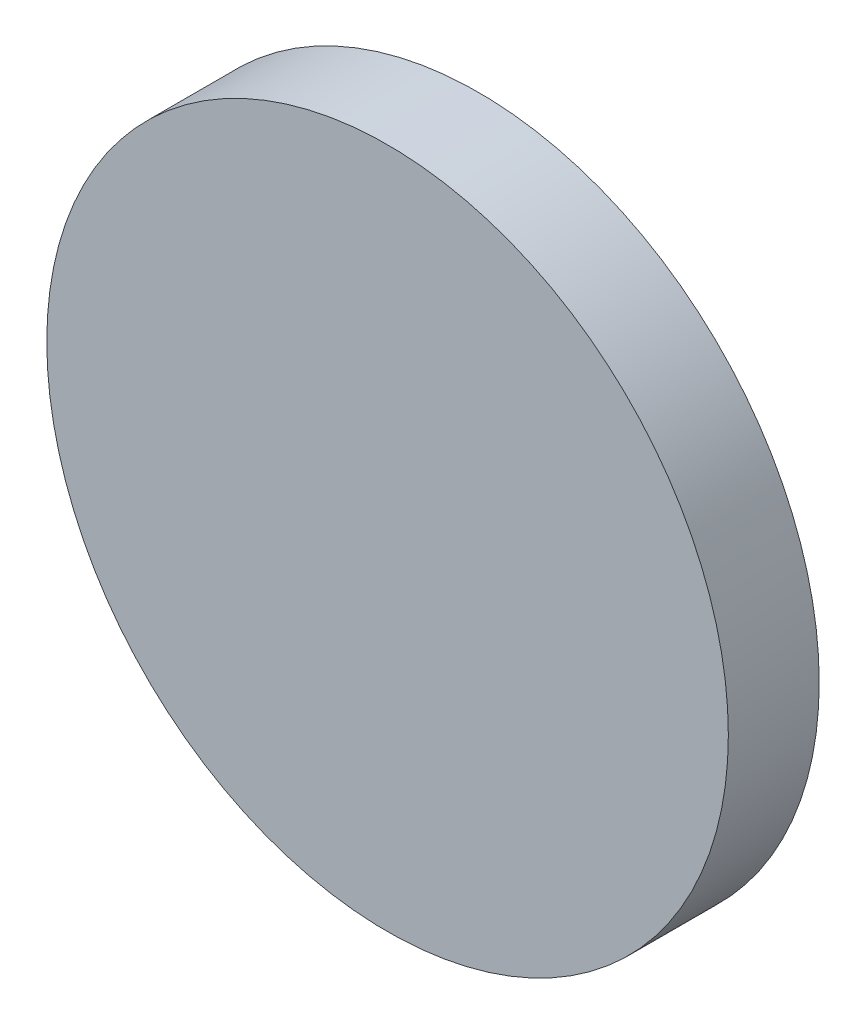
ISO-10303-21;
HEADER;
FILE_DESCRIPTION(('STEP AP214'),'2;1');
FILE_NAME('part.step','',(''),(''),'','','');
FILE_SCHEMA(('AUTOMOTIVE_DESIGN { 1 0 10303 214 1 1 1 1 }'));
ENDSEC;
DATA;
#1=APPLICATION_CONTEXT('core data for automotive mechanical design processes');
#2=APPLICATION_PROTOCOL_DEFINITION('international standard','automotive_design',2000,#1);
#3=PRODUCT_CONTEXT('',#1,'mechanical');
#4=PRODUCT('Part','Part','',(#3));
#5=PRODUCT_RELATED_PRODUCT_CATEGORY('part','',(#4));
#6=PRODUCT_DEFINITION_FORMATION('','',#4);
#7=PRODUCT_DEFINITION_CONTEXT('part definition',#1,'design');
#8=PRODUCT_DEFINITION('design','',#6,#7);
#9=PRODUCT_DEFINITION_SHAPE('','',#8);
#10=(LENGTH_UNIT() NAMED_UNIT(*) SI_UNIT(.MILLI.,.METRE.));
#11=(NAMED_UNIT(*) PLANE_ANGLE_UNIT() SI_UNIT($,.RADIAN.));
#12=(NAMED_UNIT(*) SI_UNIT($,.STERADIAN.) SOLID_ANGLE_UNIT());
#13=UNCERTAINTY_MEASURE_WITH_UNIT(LENGTH_MEASURE(1.E-05),#10,'distance_accuracy_value','');
#14=(GEOMETRIC_REPRESENTATION_CONTEXT(3) GLOBAL_UNCERTAINTY_ASSIGNED_CONTEXT((#13)) GLOBAL_UNIT_ASSIGNED_CONTEXT((#10,
#11,#12)) REPRESENTATION_CONTEXT('',''));
#15=CARTESIAN_POINT('',(0.,0.,0.));
#16=DIRECTION('',(0.,0.,1.));
#17=DIRECTION('',(1.,0.,0.));
#18=AXIS2_PLACEMENT_3D('',#15,#16,#17);
#19=CARTESIAN_POINT('',(145.,-188.494606384248,674.330286890471));
#20=DIRECTION('',(0.,0.,-1.));
#21=DIRECTION('',(-1.,0.,0.));
#22=AXIS2_PLACEMENT_3D('',#19,#20,#21);
#23=CYLINDRICAL_SURFACE('',#22,225.);
#24=CARTESIAN_POINT('',(145.,-188.494606384248,674.330286890471));
#25=DIRECTION('',(0.,0.,1.));
#26=DIRECTION('',(1.,0.,0.));
#27=AXIS2_PLACEMENT_3D('',#24,#25,#26);
#28=CIRCLE('',#27,225.);
#29=CARTESIAN_POINT('',(-80.,-188.494606384248,674.330286890471));
#30=VERTEX_POINT('',#29);
#31=EDGE_CURVE('E10',#30,#30,#28,.T.);
#32=CARTESIAN_POINT('',(145.,-188.494606384248,614.330286890471));
#33=DIRECTION('',(0.,0.,1.));
#34=DIRECTION('',(1.,0.,0.));
#35=AXIS2_PLACEMENT_3D('',#32,#33,#34);
#36=CIRCLE('',#35,225.);
#37=CARTESIAN_POINT('',(-80.,-188.494606384248,614.330286890471));
#38=VERTEX_POINT('',#37);
#39=EDGE_CURVE('E40',#38,#38,#36,.T.);
#40=CARTESIAN_POINT('',(-80.,-188.494606384248,674.330286890471));
#41=CARTESIAN_POINT('',(-80.,-188.494606384248,673.705286890471));
#42=CARTESIAN_POINT('',(-80.,-188.494606384248,673.080286890471));
#43=CARTESIAN_POINT('',(-80.,-188.494606384248,671.830286890471));
#44=CARTESIAN_POINT('',(-80.,-188.494606384248,671.205286890471));
#45=CARTESIAN_POINT('',(-80.,-188.494606384248,669.955286890471));
#46=CARTESIAN_POINT('',(-80.,-188.494606384248,669.330286890471));
#47=CARTESIAN_POINT('',(-80.,-188.494606384248,668.080286890471));
#48=CARTESIAN_POINT('',(-80.,-188.494606384248,667.455286890471));
#49=CARTESIAN_POINT('',(-80.,-188.494606384248,666.205286890471));
#50=CARTESIAN_POINT('',(-80.,-188.494606384248,665.580286890471));
#51=CARTESIAN_POINT('',(-80.,-188.494606384248,664.330286890471));
#52=CARTESIAN_POINT('',(-80.,-188.494606384248,663.705286890471));
#53=CARTESIAN_POINT('',(-80.,-188.494606384248,662.455286890471));
#54=CARTESIAN_POINT('',(-80.,-188.494606384248,661.830286890471));
#55=CARTESIAN_POINT('',(-80.,-188.494606384248,660.580286890471));
#56=CARTESIAN_POINT('',(-80.,-188.494606384248,659.955286890471));
#57=CARTESIAN_POINT('',(-80.,-188.494606384248,658.705286890471));
#58=CARTESIAN_POINT('',(-80.,-188.494606384248,658.080286890471));
#59=CARTESIAN_POINT('',(-80.,-188.494606384248,656.830286890471));
#60=CARTESIAN_POINT('',(-80.,-188.494606384248,656.205286890471));
#61=CARTESIAN_POINT('',(-80.,-188.494606384248,654.955286890471));
#62=CARTESIAN_POINT('',(-80.,-188.494606384248,654.330286890471));
#63=CARTESIAN_POINT('',(-80.,-188.494606384248,653.080286890471));
#64=CARTESIAN_POINT('',(-80.,-188.494606384248,652.455286890471));
#65=CARTESIAN_POINT('',(-80.,-188.494606384248,651.205286890471));
#66=CARTESIAN_POINT('',(-80.,-188.494606384248,650.580286890471));
#67=CARTESIAN_POINT('',(-80.,-188.494606384248,649.330286890471));
#68=CARTESIAN_POINT('',(-80.,-188.494606384248,648.705286890471));
#69=CARTESIAN_POINT('',(-80.,-188.494606384248,647.455286890471));
#70=CARTESIAN_POINT('',(-80.,-188.494606384248,646.830286890471));
#71=CARTESIAN_POINT('',(-80.,-188.494606384248,645.580286890471));
#72=CARTESIAN_POINT('',(-80.,-188.494606384248,644.955286890471));
#73=CARTESIAN_POINT('',(-80.,-188.494606384248,643.705286890471));
#74=CARTESIAN_POINT('',(-80.,-188.494606384248,643.080286890471));
#75=CARTESIAN_POINT('',(-80.,-188.494606384248,641.830286890471));
#76=CARTESIAN_POINT('',(-80.,-188.494606384248,641.205286890471));
#77=CARTESIAN_POINT('',(-80.,-188.494606384248,639.955286890471));
#78=CARTESIAN_POINT('',(-80.,-188.494606384248,639.330286890471));
#79=CARTESIAN_POINT('',(-80.,-188.494606384248,638.080286890471));
#80=CARTESIAN_POINT('',(-80.,-188.494606384248,637.455286890471));
#81=CARTESIAN_POINT('',(-80.,-188.494606384248,636.205286890471));
#82=CARTESIAN_POINT('',(-80.,-188.494606384248,635.580286890471));
#83=CARTESIAN_POINT('',(-80.,-188.494606384248,634.330286890471));
#84=CARTESIAN_POINT('',(-80.,-188.494606384248,633.705286890471));
#85=CARTESIAN_POINT('',(-80.,-188.494606384248,632.455286890471));
#86=CARTESIAN_POINT('',(-80.,-188.494606384248,631.830286890471));
#87=CARTESIAN_POINT('',(-80.,-188.494606384248,630.580286890471));
#88=CARTESIAN_POINT('',(-80.,-188.494606384248,629.955286890471));
#89=CARTESIAN_POINT('',(-80.,-188.494606384248,628.705286890471));
#90=CARTESIAN_POINT('',(-80.,-188.494606384248,628.080286890471));
#91=CARTESIAN_POINT('',(-80.,-188.494606384248,626.830286890471));
#92=CARTESIAN_POINT('',(-80.,-188.494606384248,626.205286890471));
#93=CARTESIAN_POINT('',(-80.,-188.494606384248,624.955286890471));
#94=CARTESIAN_POINT('',(-80.,-188.494606384248,624.330286890471));
#95=CARTESIAN_POINT('',(-80.,-188.494606384248,623.080286890471));
#96=CARTESIAN_POINT('',(-80.,-188.494606384248,622.455286890471));
#97=CARTESIAN_POINT('',(-80.,-188.494606384248,621.205286890471));
#98=CARTESIAN_POINT('',(-80.,-188.494606384248,620.580286890471));
#99=CARTESIAN_POINT('',(-80.,-188.494606384248,619.330286890471));
#100=CARTESIAN_POINT('',(-80.,-188.494606384248,618.705286890471));
#101=CARTESIAN_POINT('',(-80.,-188.494606384248,617.455286890471));
#102=CARTESIAN_POINT('',(-80.,-188.494606384248,616.830286890471));
#103=CARTESIAN_POINT('',(-80.,-188.494606384248,615.580286890471));
#104=CARTESIAN_POINT('',(-80.,-188.494606384248,614.955286890471));
#105=CARTESIAN_POINT('',(-80.,-188.494606384248,614.330286890471));
#106=B_SPLINE_CURVE_WITH_KNOTS('',3,(#40,#41,#42,#43,#44,#45,#46,#47,#48,#49,#50,#51,#52,#53,
#54,#55,#56,#57,#58,#59,#60,#61,#62,#63,#64,#65,#66,#67,#68,#69,#70,#71,#72,#73,#74,#75,#76,#77,
#78,#79,#80,#81,#82,#83,#84,#85,#86,#87,#88,#89,#90,#91,#92,#93,#94,#95,#96,#97,#98,#99,#100,
#101,#102,#103,#104,#105),.UNSPECIFIED.,.F.,.F.,(4,2,2,2,2,2,2,2,2,2,2,2,2,2,2,2,2,2,2,2,2,2,2,
2,2,2,2,2,2,2,2,2,4),(0.,1.87500000000007,3.75000000000003,5.6250000000001,7.50000000000006,
9.37500000000002,11.2500000000001,13.1250000000001,15.0000000000001,16.8750000000001,18.75,
20.6250000000001,22.5000000000001,24.375,26.2500000000001,28.1250000000001,30.0000000000001,
31.8750000000001,33.7500000000001,35.6250000000001,37.5000000000001,39.375,41.2500000000001,
43.1250000000001,45.0000000000001,46.8750000000001,48.7500000000001,50.6250000000001,
52.5000000000001,54.3750000000001,56.2500000000001,58.1250000000001,60.0000000000002),.UNSPECIFIED.);
#107=EDGE_CURVE('BSEAM37',#30,#38,#106,.T.);
#108=ORIENTED_EDGE('',*,*,#31,.F.);
#109=ORIENTED_EDGE('',*,*,#39,.T.);
#110=ORIENTED_EDGE('',*,*,#107,.T.);
#111=ORIENTED_EDGE('',*,*,#107,.F.);
#112=EDGE_LOOP('',(#108,#110,#109,#111));
#113=FACE_BOUND('',#112,.T.);
#114=ADVANCED_FACE('F37',(#113),#23,.T.);
#115=CARTESIAN_POINT('',(145.,-188.494606384248,674.330286890471));
#116=DIRECTION('',(0.,0.,1.));
#117=DIRECTION('',(1.,0.,0.));
#118=AXIS2_PLACEMENT_3D('',#115,#116,#117);
#119=PLANE('',#118);
#120=ORIENTED_EDGE('',*,*,#31,.T.);
#121=EDGE_LOOP('',(#120));
#122=FACE_BOUND('',#121,.T.);
#123=ADVANCED_FACE('F52',(#122),#119,.T.);
#124=CARTESIAN_POINT('',(145.,-188.494606384248,614.330286890471));
#125=DIRECTION('',(0.,0.,1.));
#126=DIRECTION('',(1.,0.,0.));
#127=AXIS2_PLACEMENT_3D('',#124,#125,#126);
#128=PLANE('',#127);
#129=ORIENTED_EDGE('',*,*,#39,.F.);
#130=EDGE_LOOP('',(#129));
#131=FACE_BOUND('',#130,.T.);
#132=ADVANCED_FACE('F50',(#131),#128,.F.);
#133=CLOSED_SHELL('',(#114,#123,#132));
#134=MANIFOLD_SOLID_BREP('B2',#133);
#135=ADVANCED_BREP_SHAPE_REPRESENTATION('',(#18,#134),#14);
#136=SHAPE_DEFINITION_REPRESENTATION(#9,#135);
ENDSEC;
END-ISO-10303-21;
